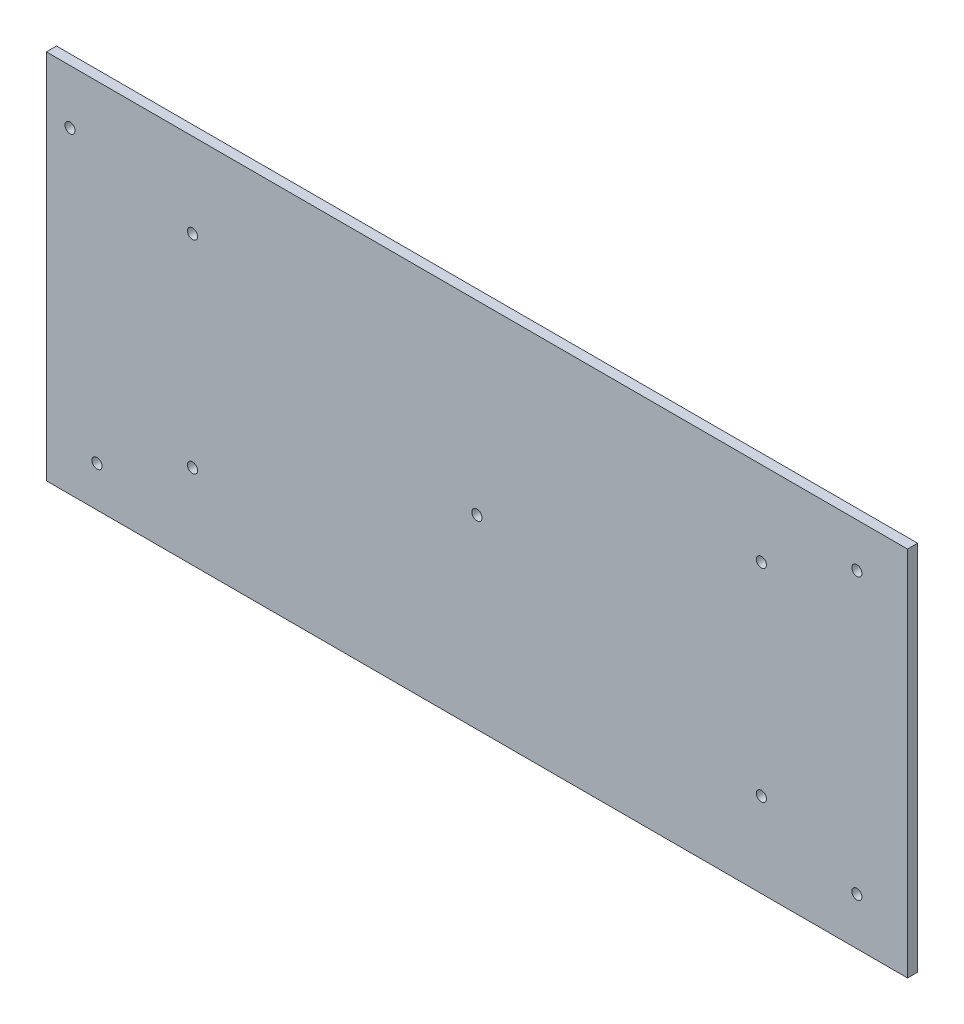
ISO-10303-21;
HEADER;
FILE_DESCRIPTION(('STEP AP214'),'2;1');
FILE_NAME('part.step','',(''),(''),'','','');
FILE_SCHEMA(('AUTOMOTIVE_DESIGN { 1 0 10303 214 1 1 1 1 }'));
ENDSEC;
DATA;
#1=APPLICATION_CONTEXT('core data for automotive mechanical design processes');
#2=APPLICATION_PROTOCOL_DEFINITION('international standard','automotive_design',2000,#1);
#3=PRODUCT_CONTEXT('',#1,'mechanical');
#4=PRODUCT('Part','Part','',(#3));
#5=PRODUCT_RELATED_PRODUCT_CATEGORY('part','',(#4));
#6=PRODUCT_DEFINITION_FORMATION('','',#4);
#7=PRODUCT_DEFINITION_CONTEXT('part definition',#1,'design');
#8=PRODUCT_DEFINITION('design','',#6,#7);
#9=PRODUCT_DEFINITION_SHAPE('','',#8);
#10=(LENGTH_UNIT() NAMED_UNIT(*) SI_UNIT(.MILLI.,.METRE.));
#11=(NAMED_UNIT(*) PLANE_ANGLE_UNIT() SI_UNIT($,.RADIAN.));
#12=(NAMED_UNIT(*) SI_UNIT($,.STERADIAN.) SOLID_ANGLE_UNIT());
#13=UNCERTAINTY_MEASURE_WITH_UNIT(LENGTH_MEASURE(1.E-05),#10,'distance_accuracy_value','');
#14=(GEOMETRIC_REPRESENTATION_CONTEXT(3) GLOBAL_UNCERTAINTY_ASSIGNED_CONTEXT((#13)) GLOBAL_UNIT_ASSIGNED_CONTEXT((#10,
#11,#12)) REPRESENTATION_CONTEXT('',''));
#15=CARTESIAN_POINT('',(0.,0.,0.));
#16=DIRECTION('',(0.,0.,1.));
#17=DIRECTION('',(1.,0.,0.));
#18=AXIS2_PLACEMENT_3D('',#15,#16,#17);
#19=CARTESIAN_POINT('',(0.,0.,3.));
#20=DIRECTION('',(0.,0.,1.));
#21=DIRECTION('',(1.,0.,0.));
#22=AXIS2_PLACEMENT_3D('',#19,#20,#21);
#23=PLANE('',#22);
#24=CARTESIAN_POINT('',(71.0964756636362,23.6818181818181,3.));
#25=DIRECTION('',(0.,0.,1.));
#26=DIRECTION('',(-1.,0.,0.));
#27=AXIS2_PLACEMENT_3D('',#24,#25,#26);
#28=CIRCLE('',#27,1.5);
#29=CARTESIAN_POINT('',(69.5964756636362,23.6818181818181,3.));
#30=VERTEX_POINT('',#29);
#31=EDGE_CURVE('E180',#30,#30,#28,.T.);
#32=ORIENTED_EDGE('',*,*,#31,.F.);
#33=EDGE_LOOP('',(#32));
#34=FACE_BOUND('',#33,.T.);
#35=CARTESIAN_POINT('',(-97.3692029363636,-36.3181818181818,3.));
#36=DIRECTION('',(0.,0.,1.));
#37=DIRECTION('',(1.,0.,0.));
#38=AXIS2_PLACEMENT_3D('',#35,#36,#37);
#39=CIRCLE('',#38,1.5);
#40=CARTESIAN_POINT('',(-95.8692029363636,-36.3181818181818,3.));
#41=VERTEX_POINT('',#40);
#42=EDGE_CURVE('E164',#41,#41,#39,.T.);
#43=ORIENTED_EDGE('',*,*,#42,.F.);
#44=EDGE_LOOP('',(#43));
#45=FACE_BOUND('',#44,.T.);
#46=CARTESIAN_POINT('',(99.3636363636363,35.6818181818182,3.));
#47=DIRECTION('',(0.,0.,1.));
#48=DIRECTION('',(1.,0.,0.));
#49=AXIS2_PLACEMENT_3D('',#46,#47,#48);
#50=CIRCLE('',#49,1.5);
#51=CARTESIAN_POINT('',(100.863636363636,35.6818181818182,3.));
#52=VERTEX_POINT('',#51);
#53=EDGE_CURVE('E148',#52,#52,#50,.T.);
#54=ORIENTED_EDGE('',*,*,#53,.F.);
#55=EDGE_LOOP('',(#54));
#56=FACE_BOUND('',#55,.T.);
#57=CARTESIAN_POINT('',(-133.636363636364,32.6818181818182,3.));
#58=DIRECTION('',(0.,0.,1.));
#59=DIRECTION('',(1.,0.,0.));
#60=AXIS2_PLACEMENT_3D('',#57,#58,#59);
#61=CIRCLE('',#60,1.5);
#62=CARTESIAN_POINT('',(-132.136363636364,32.6818181818182,3.));
#63=VERTEX_POINT('',#62);
#64=EDGE_CURVE('E132',#63,#63,#61,.T.);
#65=ORIENTED_EDGE('',*,*,#64,.F.);
#66=EDGE_LOOP('',(#65));
#67=FACE_BOUND('',#66,.T.);
#68=DIRECTION('',(0.,-1.,0.));
#69=VECTOR('',#68,1.);
#70=CARTESIAN_POINT('',(-140.636363636364,48.6818181818182,3.));
#71=LINE('',#70,#69);
#72=CARTESIAN_POINT('',(-140.636363636364,48.6818181818182,3.));
#73=VERTEX_POINT('',#72);
#74=CARTESIAN_POINT('',(-140.636363636364,-61.3181818181818,3.));
#75=VERTEX_POINT('',#74);
#76=EDGE_CURVE('E90',#73,#75,#71,.T.);
#77=ORIENTED_EDGE('',*,*,#76,.T.);
#78=DIRECTION('',(1.,0.,0.));
#79=VECTOR('',#78,1.);
#80=CARTESIAN_POINT('',(-140.636363636364,-61.3181818181818,3.));
#81=LINE('',#80,#79);
#82=CARTESIAN_POINT('',(114.363636363636,-61.3181818181818,3.));
#83=VERTEX_POINT('',#82);
#84=EDGE_CURVE('E85',#75,#83,#81,.T.);
#85=ORIENTED_EDGE('',*,*,#84,.T.);
#86=DIRECTION('',(0.,1.,0.));
#87=VECTOR('',#86,1.);
#88=CARTESIAN_POINT('',(114.363636363636,48.6818181818182,3.));
#89=LINE('',#88,#87);
#90=CARTESIAN_POINT('',(114.363636363636,48.6818181818182,3.));
#91=VERTEX_POINT('',#90);
#92=EDGE_CURVE('E88',#83,#91,#89,.T.);
#93=ORIENTED_EDGE('',*,*,#92,.T.);
#94=DIRECTION('',(-1.,0.,0.));
#95=VECTOR('',#94,1.);
#96=CARTESIAN_POINT('',(-140.636363636364,48.6818181818182,3.));
#97=LINE('',#96,#95);
#98=EDGE_CURVE('E55',#91,#73,#97,.T.);
#99=ORIENTED_EDGE('',*,*,#98,.T.);
#100=EDGE_LOOP('',(#77,#85,#93,#99));
#101=FACE_BOUND('',#100,.T.);
#102=CARTESIAN_POINT('',(-125.636363636364,-49.3181818181818,3.));
#103=DIRECTION('',(0.,0.,1.));
#104=DIRECTION('',(1.,0.,0.));
#105=AXIS2_PLACEMENT_3D('',#102,#103,#104);
#106=CIRCLE('',#105,1.5);
#107=CARTESIAN_POINT('',(-124.136363636364,-49.3181818181818,3.));
#108=VERTEX_POINT('',#107);
#109=EDGE_CURVE('E110',#108,#108,#106,.T.);
#110=ORIENTED_EDGE('',*,*,#109,.F.);
#111=EDGE_LOOP('',(#110));
#112=FACE_BOUND('',#111,.T.);
#113=CARTESIAN_POINT('',(99.3636363636363,-47.3181818181818,3.));
#114=DIRECTION('',(0.,0.,1.));
#115=DIRECTION('',(1.,0.,0.));
#116=AXIS2_PLACEMENT_3D('',#113,#114,#115);
#117=CIRCLE('',#116,1.5);
#118=CARTESIAN_POINT('',(100.863636363636,-47.3181818181818,3.));
#119=VERTEX_POINT('',#118);
#120=EDGE_CURVE('E140',#119,#119,#117,.T.);
#121=ORIENTED_EDGE('',*,*,#120,.F.);
#122=EDGE_LOOP('',(#121));
#123=FACE_BOUND('',#122,.T.);
#124=CARTESIAN_POINT('',(-97.3692029363636,23.6818181818182,3.));
#125=DIRECTION('',(0.,0.,1.));
#126=DIRECTION('',(1.,0.,0.));
#127=AXIS2_PLACEMENT_3D('',#124,#125,#126);
#128=CIRCLE('',#127,1.5);
#129=CARTESIAN_POINT('',(-95.8692029363636,23.6818181818182,3.));
#130=VERTEX_POINT('',#129);
#131=EDGE_CURVE('E156',#130,#130,#128,.T.);
#132=ORIENTED_EDGE('',*,*,#131,.F.);
#133=EDGE_LOOP('',(#132));
#134=FACE_BOUND('',#133,.T.);
#135=CARTESIAN_POINT('',(71.0964756636361,-36.3181818181819,3.));
#136=DIRECTION('',(0.,0.,1.));
#137=DIRECTION('',(-1.,0.,0.));
#138=AXIS2_PLACEMENT_3D('',#135,#136,#137);
#139=CIRCLE('',#138,1.5);
#140=CARTESIAN_POINT('',(69.5964756636361,-36.3181818181819,3.));
#141=VERTEX_POINT('',#140);
#142=EDGE_CURVE('E172',#141,#141,#139,.T.);
#143=ORIENTED_EDGE('',*,*,#142,.F.);
#144=EDGE_LOOP('',(#143));
#145=FACE_BOUND('',#144,.T.);
#146=CARTESIAN_POINT('',(-13.1363636363637,-6.31818181818181,3.));
#147=DIRECTION('',(0.,0.,1.));
#148=DIRECTION('',(1.,0.,0.));
#149=AXIS2_PLACEMENT_3D('',#146,#147,#148);
#150=CIRCLE('',#149,1.5);
#151=CARTESIAN_POINT('',(-11.6363636363637,-6.31818181818181,3.));
#152=VERTEX_POINT('',#151);
#153=EDGE_CURVE('E188',#152,#152,#150,.T.);
#154=ORIENTED_EDGE('',*,*,#153,.F.);
#155=EDGE_LOOP('',(#154));
#156=FACE_BOUND('',#155,.T.);
#157=ADVANCED_FACE('F37',(#34,#45,#56,#67,#101,#112,#123,#134,#145,#156),#23,.T.);
#158=CARTESIAN_POINT('',(0.,0.,0.));
#159=DIRECTION('',(0.,0.,1.));
#160=DIRECTION('',(1.,0.,0.));
#161=AXIS2_PLACEMENT_3D('',#158,#159,#160);
#162=PLANE('',#161);
#163=DIRECTION('',(0.,-1.,0.));
#164=VECTOR('',#163,1.);
#165=CARTESIAN_POINT('',(-140.636363636364,48.6818181818182,0.));
#166=LINE('',#165,#164);
#167=CARTESIAN_POINT('',(-140.636363636364,48.6818181818182,0.));
#168=VERTEX_POINT('',#167);
#169=CARTESIAN_POINT('',(-140.636363636364,-61.3181818181818,0.));
#170=VERTEX_POINT('',#169);
#171=EDGE_CURVE('E106',#168,#170,#166,.T.);
#172=ORIENTED_EDGE('',*,*,#171,.F.);
#173=DIRECTION('',(-1.,0.,0.));
#174=VECTOR('',#173,1.);
#175=CARTESIAN_POINT('',(-140.636363636364,48.6818181818182,0.));
#176=LINE('',#175,#174);
#177=CARTESIAN_POINT('',(114.363636363636,48.6818181818182,0.));
#178=VERTEX_POINT('',#177);
#179=EDGE_CURVE('E78',#178,#168,#176,.T.);
#180=ORIENTED_EDGE('',*,*,#179,.F.);
#181=DIRECTION('',(0.,1.,0.));
#182=VECTOR('',#181,1.);
#183=CARTESIAN_POINT('',(114.363636363636,48.6818181818182,0.));
#184=LINE('',#183,#182);
#185=CARTESIAN_POINT('',(114.363636363636,-61.3181818181818,0.));
#186=VERTEX_POINT('',#185);
#187=EDGE_CURVE('E72',#186,#178,#184,.T.);
#188=ORIENTED_EDGE('',*,*,#187,.F.);
#189=DIRECTION('',(1.,0.,0.));
#190=VECTOR('',#189,1.);
#191=CARTESIAN_POINT('',(-140.636363636364,-61.3181818181818,0.));
#192=LINE('',#191,#190);
#193=EDGE_CURVE('E95',#170,#186,#192,.T.);
#194=ORIENTED_EDGE('',*,*,#193,.F.);
#195=EDGE_LOOP('',(#172,#180,#188,#194));
#196=FACE_BOUND('',#195,.T.);
#197=CARTESIAN_POINT('',(-125.636363636364,-49.3181818181818,0.));
#198=DIRECTION('',(0.,0.,1.));
#199=DIRECTION('',(1.,0.,0.));
#200=AXIS2_PLACEMENT_3D('',#197,#198,#199);
#201=CIRCLE('',#200,1.5);
#202=CARTESIAN_POINT('',(-124.136363636364,-49.3181818181818,0.));
#203=VERTEX_POINT('',#202);
#204=EDGE_CURVE('E128',#203,#203,#201,.T.);
#205=ORIENTED_EDGE('',*,*,#204,.T.);
#206=EDGE_LOOP('',(#205));
#207=FACE_BOUND('',#206,.T.);
#208=CARTESIAN_POINT('',(-133.636363636364,32.6818181818182,0.));
#209=DIRECTION('',(0.,0.,1.));
#210=DIRECTION('',(1.,0.,0.));
#211=AXIS2_PLACEMENT_3D('',#208,#209,#210);
#212=CIRCLE('',#211,1.5);
#213=CARTESIAN_POINT('',(-132.136363636364,32.6818181818182,0.));
#214=VERTEX_POINT('',#213);
#215=EDGE_CURVE('E136',#214,#214,#212,.T.);
#216=ORIENTED_EDGE('',*,*,#215,.T.);
#217=EDGE_LOOP('',(#216));
#218=FACE_BOUND('',#217,.T.);
#219=CARTESIAN_POINT('',(99.3636363636363,-47.3181818181818,0.));
#220=DIRECTION('',(0.,0.,1.));
#221=DIRECTION('',(1.,0.,0.));
#222=AXIS2_PLACEMENT_3D('',#219,#220,#221);
#223=CIRCLE('',#222,1.5);
#224=CARTESIAN_POINT('',(100.863636363636,-47.3181818181818,0.));
#225=VERTEX_POINT('',#224);
#226=EDGE_CURVE('E144',#225,#225,#223,.T.);
#227=ORIENTED_EDGE('',*,*,#226,.T.);
#228=EDGE_LOOP('',(#227));
#229=FACE_BOUND('',#228,.T.);
#230=CARTESIAN_POINT('',(99.3636363636363,35.6818181818182,0.));
#231=DIRECTION('',(0.,0.,1.));
#232=DIRECTION('',(1.,0.,0.));
#233=AXIS2_PLACEMENT_3D('',#230,#231,#232);
#234=CIRCLE('',#233,1.5);
#235=CARTESIAN_POINT('',(100.863636363636,35.6818181818182,0.));
#236=VERTEX_POINT('',#235);
#237=EDGE_CURVE('E152',#236,#236,#234,.T.);
#238=ORIENTED_EDGE('',*,*,#237,.T.);
#239=EDGE_LOOP('',(#238));
#240=FACE_BOUND('',#239,.T.);
#241=CARTESIAN_POINT('',(-97.3692029363636,23.6818181818182,0.));
#242=DIRECTION('',(0.,0.,1.));
#243=DIRECTION('',(1.,0.,0.));
#244=AXIS2_PLACEMENT_3D('',#241,#242,#243);
#245=CIRCLE('',#244,1.5);
#246=CARTESIAN_POINT('',(-95.8692029363636,23.6818181818182,0.));
#247=VERTEX_POINT('',#246);
#248=EDGE_CURVE('E160',#247,#247,#245,.T.);
#249=ORIENTED_EDGE('',*,*,#248,.T.);
#250=EDGE_LOOP('',(#249));
#251=FACE_BOUND('',#250,.T.);
#252=CARTESIAN_POINT('',(-97.3692029363636,-36.3181818181818,0.));
#253=DIRECTION('',(0.,0.,1.));
#254=DIRECTION('',(1.,0.,0.));
#255=AXIS2_PLACEMENT_3D('',#252,#253,#254);
#256=CIRCLE('',#255,1.5);
#257=CARTESIAN_POINT('',(-95.8692029363636,-36.3181818181818,0.));
#258=VERTEX_POINT('',#257);
#259=EDGE_CURVE('E168',#258,#258,#256,.T.);
#260=ORIENTED_EDGE('',*,*,#259,.T.);
#261=EDGE_LOOP('',(#260));
#262=FACE_BOUND('',#261,.T.);
#263=CARTESIAN_POINT('',(71.0964756636361,-36.3181818181819,0.));
#264=DIRECTION('',(0.,0.,1.));
#265=DIRECTION('',(-1.,0.,0.));
#266=AXIS2_PLACEMENT_3D('',#263,#264,#265);
#267=CIRCLE('',#266,1.5);
#268=CARTESIAN_POINT('',(69.5964756636361,-36.3181818181819,0.));
#269=VERTEX_POINT('',#268);
#270=EDGE_CURVE('E176',#269,#269,#267,.T.);
#271=ORIENTED_EDGE('',*,*,#270,.T.);
#272=EDGE_LOOP('',(#271));
#273=FACE_BOUND('',#272,.T.);
#274=CARTESIAN_POINT('',(71.0964756636362,23.6818181818181,0.));
#275=DIRECTION('',(0.,0.,1.));
#276=DIRECTION('',(-1.,0.,0.));
#277=AXIS2_PLACEMENT_3D('',#274,#275,#276);
#278=CIRCLE('',#277,1.5);
#279=CARTESIAN_POINT('',(69.5964756636362,23.6818181818181,0.));
#280=VERTEX_POINT('',#279);
#281=EDGE_CURVE('E184',#280,#280,#278,.T.);
#282=ORIENTED_EDGE('',*,*,#281,.T.);
#283=EDGE_LOOP('',(#282));
#284=FACE_BOUND('',#283,.T.);
#285=CARTESIAN_POINT('',(-13.1363636363637,-6.31818181818181,0.));
#286=DIRECTION('',(0.,0.,1.));
#287=DIRECTION('',(1.,0.,0.));
#288=AXIS2_PLACEMENT_3D('',#285,#286,#287);
#289=CIRCLE('',#288,1.5);
#290=CARTESIAN_POINT('',(-11.6363636363637,-6.31818181818181,0.));
#291=VERTEX_POINT('',#290);
#292=EDGE_CURVE('E192',#291,#291,#289,.T.);
#293=ORIENTED_EDGE('',*,*,#292,.T.);
#294=EDGE_LOOP('',(#293));
#295=FACE_BOUND('',#294,.T.);
#296=ADVANCED_FACE('F123',(#196,#207,#218,#229,#240,#251,#262,#273,#284,#295),#162,.F.);
#297=CARTESIAN_POINT('',(-140.636363636364,48.6818181818182,3.));
#298=DIRECTION('',(1.,0.,0.));
#299=DIRECTION('',(0.,1.,0.));
#300=AXIS2_PLACEMENT_3D('',#297,#298,#299);
#301=PLANE('',#300);
#302=ORIENTED_EDGE('',*,*,#171,.T.);
#303=DIRECTION('',(0.,0.,-1.));
#304=VECTOR('',#303,1.);
#305=CARTESIAN_POINT('',(-140.636363636364,-61.3181818181818,3.));
#306=LINE('',#305,#304);
#307=EDGE_CURVE('E11',#75,#170,#306,.T.);
#308=ORIENTED_EDGE('',*,*,#307,.F.);
#309=ORIENTED_EDGE('',*,*,#76,.F.);
#310=DIRECTION('',(0.,0.,-1.));
#311=VECTOR('',#310,1.);
#312=CARTESIAN_POINT('',(-140.636363636364,48.6818181818182,3.));
#313=LINE('',#312,#311);
#314=EDGE_CURVE('E102',#73,#168,#313,.T.);
#315=ORIENTED_EDGE('',*,*,#314,.T.);
#316=EDGE_LOOP('',(#302,#308,#309,#315));
#317=FACE_BOUND('',#316,.T.);
#318=ADVANCED_FACE('F39',(#317),#301,.F.);
#319=CARTESIAN_POINT('',(-140.636363636364,-61.3181818181818,3.));
#320=DIRECTION('',(0.,1.,0.));
#321=DIRECTION('',(0.,0.,1.));
#322=AXIS2_PLACEMENT_3D('',#319,#320,#321);
#323=PLANE('',#322);
#324=ORIENTED_EDGE('',*,*,#193,.T.);
#325=DIRECTION('',(0.,0.,-1.));
#326=VECTOR('',#325,1.);
#327=CARTESIAN_POINT('',(114.363636363636,-61.3181818181818,3.));
#328=LINE('',#327,#326);
#329=EDGE_CURVE('E47',#83,#186,#328,.T.);
#330=ORIENTED_EDGE('',*,*,#329,.F.);
#331=ORIENTED_EDGE('',*,*,#84,.F.);
#332=ORIENTED_EDGE('',*,*,#307,.T.);
#333=EDGE_LOOP('',(#324,#330,#331,#332));
#334=FACE_BOUND('',#333,.T.);
#335=ADVANCED_FACE('F94',(#334),#323,.F.);
#336=CARTESIAN_POINT('',(114.363636363636,48.6818181818182,3.));
#337=DIRECTION('',(-1.,0.,0.));
#338=DIRECTION('',(0.,0.,1.));
#339=AXIS2_PLACEMENT_3D('',#336,#337,#338);
#340=PLANE('',#339);
#341=ORIENTED_EDGE('',*,*,#187,.T.);
#342=DIRECTION('',(0.,0.,-1.));
#343=VECTOR('',#342,1.);
#344=CARTESIAN_POINT('',(114.363636363636,48.6818181818182,3.));
#345=LINE('',#344,#343);
#346=EDGE_CURVE('E97',#91,#178,#345,.T.);
#347=ORIENTED_EDGE('',*,*,#346,.F.);
#348=ORIENTED_EDGE('',*,*,#92,.F.);
#349=ORIENTED_EDGE('',*,*,#329,.T.);
#350=EDGE_LOOP('',(#341,#347,#348,#349));
#351=FACE_BOUND('',#350,.T.);
#352=ADVANCED_FACE('F98',(#351),#340,.F.);
#353=CARTESIAN_POINT('',(-140.636363636364,48.6818181818182,3.));
#354=DIRECTION('',(0.,-1.,0.));
#355=DIRECTION('',(0.,0.,-1.));
#356=AXIS2_PLACEMENT_3D('',#353,#354,#355);
#357=PLANE('',#356);
#358=ORIENTED_EDGE('',*,*,#179,.T.);
#359=ORIENTED_EDGE('',*,*,#314,.F.);
#360=ORIENTED_EDGE('',*,*,#98,.F.);
#361=ORIENTED_EDGE('',*,*,#346,.T.);
#362=EDGE_LOOP('',(#358,#359,#360,#361));
#363=FACE_BOUND('',#362,.T.);
#364=ADVANCED_FACE('F120',(#363),#357,.F.);
#365=CARTESIAN_POINT('',(-125.636363636364,-49.3181818181818,3.));
#366=DIRECTION('',(0.,0.,-1.));
#367=DIRECTION('',(-1.,0.,0.));
#368=AXIS2_PLACEMENT_3D('',#365,#366,#367);
#369=CYLINDRICAL_SURFACE('',#368,1.5);
#370=ORIENTED_EDGE('',*,*,#109,.T.);
#371=EDGE_LOOP('',(#370));
#372=FACE_BOUND('',#371,.T.);
#373=ORIENTED_EDGE('',*,*,#204,.F.);
#374=EDGE_LOOP('',(#373));
#375=FACE_BOUND('',#374,.T.);
#376=ADVANCED_FACE('F213',(#372,#375),#369,.F.);
#377=CARTESIAN_POINT('',(-133.636363636364,32.6818181818182,3.));
#378=DIRECTION('',(0.,0.,-1.));
#379=DIRECTION('',(-1.,0.,0.));
#380=AXIS2_PLACEMENT_3D('',#377,#378,#379);
#381=CYLINDRICAL_SURFACE('',#380,1.5);
#382=ORIENTED_EDGE('',*,*,#64,.T.);
#383=EDGE_LOOP('',(#382));
#384=FACE_BOUND('',#383,.T.);
#385=ORIENTED_EDGE('',*,*,#215,.F.);
#386=EDGE_LOOP('',(#385));
#387=FACE_BOUND('',#386,.T.);
#388=ADVANCED_FACE('F259',(#384,#387),#381,.F.);
#389=CARTESIAN_POINT('',(99.3636363636363,-47.3181818181818,3.));
#390=DIRECTION('',(0.,0.,-1.));
#391=DIRECTION('',(-1.,0.,0.));
#392=AXIS2_PLACEMENT_3D('',#389,#390,#391);
#393=CYLINDRICAL_SURFACE('',#392,1.5);
#394=ORIENTED_EDGE('',*,*,#120,.T.);
#395=EDGE_LOOP('',(#394));
#396=FACE_BOUND('',#395,.T.);
#397=ORIENTED_EDGE('',*,*,#226,.F.);
#398=EDGE_LOOP('',(#397));
#399=FACE_BOUND('',#398,.T.);
#400=ADVANCED_FACE('F267',(#396,#399),#393,.F.);
#401=CARTESIAN_POINT('',(99.3636363636363,35.6818181818182,3.));
#402=DIRECTION('',(0.,0.,-1.));
#403=DIRECTION('',(-1.,0.,0.));
#404=AXIS2_PLACEMENT_3D('',#401,#402,#403);
#405=CYLINDRICAL_SURFACE('',#404,1.5);
#406=ORIENTED_EDGE('',*,*,#53,.T.);
#407=EDGE_LOOP('',(#406));
#408=FACE_BOUND('',#407,.T.);
#409=ORIENTED_EDGE('',*,*,#237,.F.);
#410=EDGE_LOOP('',(#409));
#411=FACE_BOUND('',#410,.T.);
#412=ADVANCED_FACE('F275',(#408,#411),#405,.F.);
#413=CARTESIAN_POINT('',(-97.3692029363636,23.6818181818182,3.));
#414=DIRECTION('',(0.,0.,-1.));
#415=DIRECTION('',(-1.,0.,0.));
#416=AXIS2_PLACEMENT_3D('',#413,#414,#415);
#417=CYLINDRICAL_SURFACE('',#416,1.5);
#418=ORIENTED_EDGE('',*,*,#131,.T.);
#419=EDGE_LOOP('',(#418));
#420=FACE_BOUND('',#419,.T.);
#421=ORIENTED_EDGE('',*,*,#248,.F.);
#422=EDGE_LOOP('',(#421));
#423=FACE_BOUND('',#422,.T.);
#424=ADVANCED_FACE('F284',(#420,#423),#417,.F.);
#425=CARTESIAN_POINT('',(-97.3692029363636,-36.3181818181818,3.));
#426=DIRECTION('',(0.,0.,-1.));
#427=DIRECTION('',(-1.,0.,0.));
#428=AXIS2_PLACEMENT_3D('',#425,#426,#427);
#429=CYLINDRICAL_SURFACE('',#428,1.5);
#430=ORIENTED_EDGE('',*,*,#42,.T.);
#431=EDGE_LOOP('',(#430));
#432=FACE_BOUND('',#431,.T.);
#433=ORIENTED_EDGE('',*,*,#259,.F.);
#434=EDGE_LOOP('',(#433));
#435=FACE_BOUND('',#434,.T.);
#436=ADVANCED_FACE('F293',(#432,#435),#429,.F.);
#437=CARTESIAN_POINT('',(71.0964756636361,-36.3181818181819,3.));
#438=DIRECTION('',(0.,0.,-1.));
#439=DIRECTION('',(-1.,0.,0.));
#440=AXIS2_PLACEMENT_3D('',#437,#438,#439);
#441=CYLINDRICAL_SURFACE('',#440,1.5);
#442=ORIENTED_EDGE('',*,*,#142,.T.);
#443=EDGE_LOOP('',(#442));
#444=FACE_BOUND('',#443,.T.);
#445=ORIENTED_EDGE('',*,*,#270,.F.);
#446=EDGE_LOOP('',(#445));
#447=FACE_BOUND('',#446,.T.);
#448=ADVANCED_FACE('F302',(#444,#447),#441,.F.);
#449=CARTESIAN_POINT('',(71.0964756636362,23.6818181818181,3.));
#450=DIRECTION('',(0.,0.,-1.));
#451=DIRECTION('',(-1.,0.,0.));
#452=AXIS2_PLACEMENT_3D('',#449,#450,#451);
#453=CYLINDRICAL_SURFACE('',#452,1.5);
#454=ORIENTED_EDGE('',*,*,#31,.T.);
#455=EDGE_LOOP('',(#454));
#456=FACE_BOUND('',#455,.T.);
#457=ORIENTED_EDGE('',*,*,#281,.F.);
#458=EDGE_LOOP('',(#457));
#459=FACE_BOUND('',#458,.T.);
#460=ADVANCED_FACE('F311',(#456,#459),#453,.F.);
#461=CARTESIAN_POINT('',(-13.1363636363637,-6.31818181818181,3.));
#462=DIRECTION('',(0.,0.,-1.));
#463=DIRECTION('',(-1.,0.,0.));
#464=AXIS2_PLACEMENT_3D('',#461,#462,#463);
#465=CYLINDRICAL_SURFACE('',#464,1.5);
#466=ORIENTED_EDGE('',*,*,#153,.T.);
#467=EDGE_LOOP('',(#466));
#468=FACE_BOUND('',#467,.T.);
#469=ORIENTED_EDGE('',*,*,#292,.F.);
#470=EDGE_LOOP('',(#469));
#471=FACE_BOUND('',#470,.T.);
#472=ADVANCED_FACE('F200',(#468,#471),#465,.F.);
#473=CLOSED_SHELL('',(#157,#296,#318,#335,#352,#364,#376,#388,#400,#412,#424,#436,#448,#460,#472));
#474=MANIFOLD_SOLID_BREP('B2',#473);
#475=ADVANCED_BREP_SHAPE_REPRESENTATION('',(#18,#474),#14);
#476=SHAPE_DEFINITION_REPRESENTATION(#9,#475);
ENDSEC;
END-ISO-10303-21;
